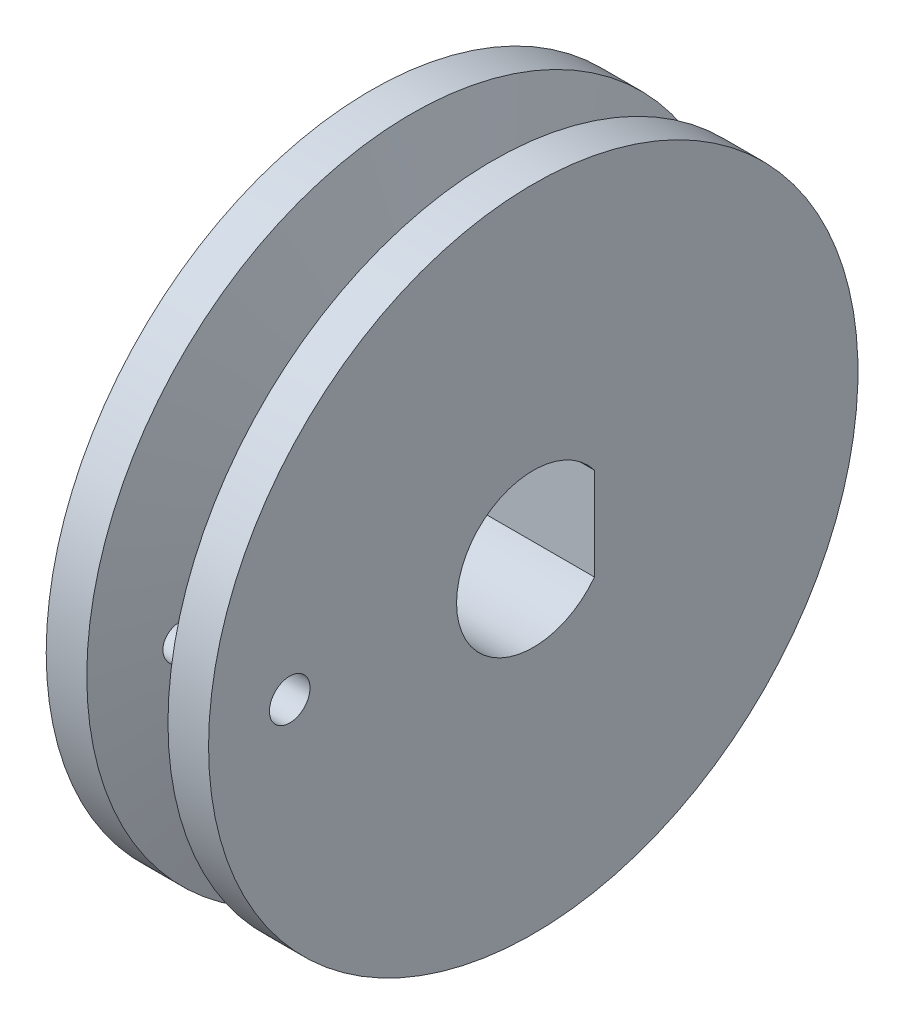
ISO-10303-21;
HEADER;
FILE_DESCRIPTION(('STEP AP214'),'2;1');
FILE_NAME('part.step','',(''),(''),'','','');
FILE_SCHEMA(('AUTOMOTIVE_DESIGN { 1 0 10303 214 1 1 1 1 }'));
ENDSEC;
DATA;
#1=APPLICATION_CONTEXT('core data for automotive mechanical design processes');
#2=APPLICATION_PROTOCOL_DEFINITION('international standard','automotive_design',2000,#1);
#3=PRODUCT_CONTEXT('',#1,'mechanical');
#4=PRODUCT('Part','Part','',(#3));
#5=PRODUCT_RELATED_PRODUCT_CATEGORY('part','',(#4));
#6=PRODUCT_DEFINITION_FORMATION('','',#4);
#7=PRODUCT_DEFINITION_CONTEXT('part definition',#1,'design');
#8=PRODUCT_DEFINITION('design','',#6,#7);
#9=PRODUCT_DEFINITION_SHAPE('','',#8);
#10=(LENGTH_UNIT() NAMED_UNIT(*) SI_UNIT(.MILLI.,.METRE.));
#11=(NAMED_UNIT(*) PLANE_ANGLE_UNIT() SI_UNIT($,.RADIAN.));
#12=(NAMED_UNIT(*) SI_UNIT($,.STERADIAN.) SOLID_ANGLE_UNIT());
#13=UNCERTAINTY_MEASURE_WITH_UNIT(LENGTH_MEASURE(1.E-05),#10,'distance_accuracy_value','');
#14=(GEOMETRIC_REPRESENTATION_CONTEXT(3) GLOBAL_UNCERTAINTY_ASSIGNED_CONTEXT((#13)) GLOBAL_UNIT_ASSIGNED_CONTEXT((#10,
#11,#12)) REPRESENTATION_CONTEXT('',''));
#15=CARTESIAN_POINT('',(0.,0.,0.));
#16=DIRECTION('',(0.,0.,1.));
#17=DIRECTION('',(1.,0.,0.));
#18=AXIS2_PLACEMENT_3D('',#15,#16,#17);
#19=CARTESIAN_POINT('',(0.,0.,0.));
#20=DIRECTION('',(1.,0.,0.));
#21=DIRECTION('',(0.,0.,-1.));
#22=AXIS2_PLACEMENT_3D('',#19,#20,#21);
#23=PLANE('',#22);
#24=CARTESIAN_POINT('',(0.,0.,9.525));
#25=DIRECTION('',(1.,0.,0.));
#26=DIRECTION('',(0.,0.,-1.));
#27=AXIS2_PLACEMENT_3D('',#24,#25,#26);
#28=CIRCLE('',#27,0.793749999999999);
#29=CARTESIAN_POINT('',(0.,0.,8.73125));
#30=VERTEX_POINT('',#29);
#31=EDGE_CURVE('E133',#30,#30,#28,.T.);
#32=ORIENTED_EDGE('',*,*,#31,.T.);
#33=EDGE_LOOP('',(#32));
#34=FACE_BOUND('',#33,.T.);
#35=DIRECTION('',(0.,1.,0.));
#36=VECTOR('',#35,1.);
#37=CARTESIAN_POINT('',(0.,-1.80937306039412,-2.392934));
#38=LINE('',#37,#36);
#39=CARTESIAN_POINT('',(0.,-1.80937306039412,-2.392934));
#40=VERTEX_POINT('',#39);
#41=CARTESIAN_POINT('',(0.,1.80937306039412,-2.392934));
#42=VERTEX_POINT('',#41);
#43=EDGE_CURVE('E134',#40,#42,#38,.T.);
#44=ORIENTED_EDGE('',*,*,#43,.T.);
#45=CARTESIAN_POINT('',(0.,0.,0.));
#46=DIRECTION('',(1.,0.,0.));
#47=DIRECTION('',(0.,0.,-1.));
#48=AXIS2_PLACEMENT_3D('',#45,#46,#47);
#49=CIRCLE('',#48,2.999994);
#50=EDGE_CURVE('E56',#42,#40,#49,.T.);
#51=ORIENTED_EDGE('',*,*,#50,.T.);
#52=EDGE_LOOP('',(#44,#51));
#53=FACE_BOUND('',#52,.T.);
#54=CARTESIAN_POINT('',(0.,0.,0.));
#55=DIRECTION('',(-1.,0.,0.));
#56=DIRECTION('',(0.,0.,1.));
#57=AXIS2_PLACEMENT_3D('',#54,#55,#56);
#58=CIRCLE('',#57,12.7);
#59=CARTESIAN_POINT('',(0.,0.,12.7));
#60=VERTEX_POINT('',#59);
#61=EDGE_CURVE('E71',#60,#60,#58,.T.);
#62=ORIENTED_EDGE('',*,*,#61,.T.);
#63=EDGE_LOOP('',(#62));
#64=FACE_BOUND('',#63,.T.);
#65=ADVANCED_FACE('F39',(#34,#53,#64),#23,.F.);
#66=CARTESIAN_POINT('',(0.,0.,0.));
#67=DIRECTION('',(-1.,0.,0.));
#68=DIRECTION('',(0.,0.,1.));
#69=AXIS2_PLACEMENT_3D('',#66,#67,#68);
#70=CYLINDRICAL_SURFACE('',#69,12.7);
#71=ORIENTED_EDGE('',*,*,#61,.F.);
#72=EDGE_LOOP('',(#71));
#73=FACE_BOUND('',#72,.T.);
#74=CARTESIAN_POINT('',(1.5875,0.,0.));
#75=DIRECTION('',(-1.,0.,0.));
#76=DIRECTION('',(0.,0.,1.));
#77=AXIS2_PLACEMENT_3D('',#74,#75,#76);
#78=CIRCLE('',#77,12.7);
#79=CARTESIAN_POINT('',(1.5875,0.,12.7));
#80=VERTEX_POINT('',#79);
#81=EDGE_CURVE('E94',#80,#80,#78,.T.);
#82=ORIENTED_EDGE('',*,*,#81,.T.);
#83=EDGE_LOOP('',(#82));
#84=FACE_BOUND('',#83,.T.);
#85=ADVANCED_FACE('F101',(#73,#84),#70,.T.);
#86=CARTESIAN_POINT('',(3.175,0.,0.));
#87=DIRECTION('',(-1.,0.,0.));
#88=DIRECTION('',(0.,0.,1.));
#89=AXIS2_PLACEMENT_3D('',#86,#87,#88);
#90=CONICAL_SURFACE('',#89,6.35,1.32581766366803);
#91=CARTESIAN_POINT('',(2.42205219299432,-0.769454038169109,9.33011658357974));
#92=CARTESIAN_POINT('',(2.4107397683525,-0.780716390235326,9.37459143730435));
#93=CARTESIAN_POINT('',(2.39926194634905,-0.788114447956199,9.42004158488257));
#94=CARTESIAN_POINT('',(2.37631328129466,-0.794965976843851,9.51158346613593));
#95=CARTESIAN_POINT('',(2.36484246799103,-0.794408834234208,9.5576759749713));
#96=CARTESIAN_POINT('',(2.34223718573583,-0.785325969239502,9.64914940975929));
#97=CARTESIAN_POINT('',(2.33110264204524,-0.776802031205737,9.69453049273836));
#98=CARTESIAN_POINT('',(2.30947412371127,-0.751972703506001,9.78325924612239));
#99=CARTESIAN_POINT('',(2.29897994845597,-0.73566976507489,9.8266075523516));
#100=CARTESIAN_POINT('',(2.278990224139,-0.695827860765712,9.90966566277669));
#101=CARTESIAN_POINT('',(2.26948762042817,-0.672345466460873,9.9494008686891));
#102=CARTESIAN_POINT('',(2.25164832094701,-0.618698986628892,10.0243742501778));
#103=CARTESIAN_POINT('',(2.2433115482243,-0.588535342447313,10.059612722554));
#104=CARTESIAN_POINT('',(2.22821570150382,-0.523124836186884,10.1236873497359));
#105=CARTESIAN_POINT('',(2.22142434817622,-0.488013033729028,10.152653727652));
#106=CARTESIAN_POINT('',(2.20936385433403,-0.413177442968312,10.2042555939953));
#107=CARTESIAN_POINT('',(2.20409446660112,-0.37345440515614,10.2268921105854));
#108=CARTESIAN_POINT('',(2.19534579931353,-0.291667519143426,10.2645552646822));
#109=CARTESIAN_POINT('',(2.19182249141825,-0.249694456047824,10.2797689017152));
#110=CARTESIAN_POINT('',(2.18645683687822,-0.163693260894292,10.3029629227268));
#111=CARTESIAN_POINT('',(2.18461427475093,-0.119665393036704,10.3109442339356));
#112=CARTESIAN_POINT('',(2.18268047804403,-0.0317205153053351,10.3193213412859));
#113=CARTESIAN_POINT('',(2.18255599141434,0.0121821036243596,10.3198611616056));
#114=CARTESIAN_POINT('',(2.18397594644027,0.0994485997530278,10.31370911978));
#115=CARTESIAN_POINT('',(2.18552030337281,0.142812504188165,10.3070176247507));
#116=CARTESIAN_POINT('',(2.1902235081368,0.227542214206593,10.2866771902879));
#117=CARTESIAN_POINT('',(2.19337390283262,0.268917252543197,10.2730646795583));
#118=CARTESIAN_POINT('',(2.20120102804999,0.348768662008727,10.2393375773391));
#119=CARTESIAN_POINT('',(2.20587780570822,0.387244943575136,10.2192227850508));
#120=CARTESIAN_POINT('',(2.21669286916985,0.460653344528927,10.1728744332704));
#121=CARTESIAN_POINT('',(2.22284580233666,0.495544590994493,10.1465796084351));
#122=CARTESIAN_POINT('',(2.23642925929041,0.560421009524583,10.0887865377969));
#123=CARTESIAN_POINT('',(2.24385990797108,0.590405701425073,10.0572877833339));
#124=CARTESIAN_POINT('',(2.25999223745678,0.64533947633634,9.98925173835838));
#125=CARTESIAN_POINT('',(2.26871846990885,0.670162012451892,9.95261812835679));
#126=CARTESIAN_POINT('',(2.28709444948894,0.713321956494704,9.87592432897158));
#127=CARTESIAN_POINT('',(2.2967443190179,0.731658503378802,9.83586368551041));
#128=CARTESIAN_POINT('',(2.31699423220166,0.761829185795334,9.75232967525658));
#129=CARTESIAN_POINT('',(2.32761263020919,0.773478956998256,9.70879414698943));
#130=CARTESIAN_POINT('',(2.34929907835624,0.78926123972469,9.62048945029555));
#131=CARTESIAN_POINT('',(2.36036718523181,0.793392799708368,9.5757201264417));
#132=CARTESIAN_POINT('',(2.38289693895834,0.794069681947352,9.48523291126329));
#133=CARTESIAN_POINT('',(2.39436198638339,0.790455826371187,9.43951461133943));
#134=CARTESIAN_POINT('',(2.41714022480215,0.7754173688962,9.3493390955973));
#135=CARTESIAN_POINT('',(2.4284534053784,0.763992233938164,9.30488196605978));
#136=CARTESIAN_POINT('',(2.45065613623344,0.733525871154754,9.21824438845325));
#137=CARTESIAN_POINT('',(2.46154295814856,0.714442334458217,9.17607809029142));
#138=CARTESIAN_POINT('',(2.48247518337972,0.669132132928347,9.09554029171331));
#139=CARTESIAN_POINT('',(2.49252062559318,0.642905798548822,9.05716861585485));
#140=CARTESIAN_POINT('',(2.51127883162215,0.58441857646217,8.98593933935526));
#141=CARTESIAN_POINT('',(2.52000895491806,0.552251669478756,8.95300922794292));
#142=CARTESIAN_POINT('',(2.53598108653367,0.482495172100332,8.89305754125928));
#143=CARTESIAN_POINT('',(2.54322335780507,0.444906541901772,8.86603492188837));
#144=CARTESIAN_POINT('',(2.55572698733986,0.366601024087381,8.81955542195992));
#145=CARTESIAN_POINT('',(2.56104228571078,0.326015430546006,8.79989192691016));
#146=CARTESIAN_POINT('',(2.56977107566086,0.241922381626515,8.76767666085327));
#147=CARTESIAN_POINT('',(2.57318496534634,0.19841554002219,8.75512340113552));
#148=CARTESIAN_POINT('',(2.57788327304305,0.111211864522665,8.7378637011833));
#149=CARTESIAN_POINT('',(2.57923220593459,0.0675654555564249,8.73291950522093));
#150=CARTESIAN_POINT('',(2.57994807930716,-0.0199593084126621,8.73029446481768));
#151=CARTESIAN_POINT('',(2.57931524288594,-0.0638376367520175,8.73261280279679));
#152=CARTESIAN_POINT('',(2.5761207720381,-0.149864711462099,8.74433665671649));
#153=CARTESIAN_POINT('',(2.57358924105494,-0.192029734982707,8.75363156220187));
#154=CARTESIAN_POINT('',(2.56673755248025,-0.274164685696527,8.77886423282008));
#155=CARTESIAN_POINT('',(2.5624174309054,-0.314134657072926,8.79480186418906));
#156=CARTESIAN_POINT('',(2.55211160965563,-0.391163870134534,8.83297790230852));
#157=CARTESIAN_POINT('',(2.54611114260483,-0.428193386772811,8.85527220649767));
#158=CARTESIAN_POINT('',(2.53268345462639,-0.497998569895608,8.90541607407123));
#159=CARTESIAN_POINT('',(2.52525570533439,-0.530772653512601,8.9332676948608));
#160=CARTESIAN_POINT('',(2.50900072337024,-0.592134142645329,8.99457451434313));
#161=CARTESIAN_POINT('',(2.50013952688928,-0.62057491303568,9.02816725222671));
#162=CARTESIAN_POINT('',(2.48147899929388,-0.671411652345604,9.09937571932279));
#163=CARTESIAN_POINT('',(2.47168061674636,-0.693813647467695,9.13698738522841));
#164=CARTESIAN_POINT('',(2.4551865253342,-0.725016062478383,9.20073799668404));
#165=CARTESIAN_POINT('',(2.44868136173061,-0.735784279409087,9.22598410778439));
#166=CARTESIAN_POINT('',(2.43548781139099,-0.754644605826032,9.277410012206));
#167=CARTESIAN_POINT('',(2.42879942188112,-0.762736674774386,9.3035898196641));
#168=CARTESIAN_POINT('',(2.42205219299432,-0.769454038169109,9.33011658357974));
#169=B_SPLINE_CURVE_WITH_KNOTS('',3,(#91,#92,#93,#94,#95,#96,#97,#98,#99,#100,#101,#102,#103,
#104,#105,#106,#107,#108,#109,#110,#111,#112,#113,#114,#115,#116,#117,#118,#119,#120,#121,#122,
#123,#124,#125,#126,#127,#128,#129,#130,#131,#132,#133,#134,#135,#136,#137,#138,#139,#140,#141,
#142,#143,#144,#145,#146,#147,#148,#149,#150,#151,#152,#153,#154,#155,#156,#157,#158,#159,#160,
#161,#162,#163,#164,#165,#166,#167,#168),.UNSPECIFIED.,.T.,.F.,(4,2,2,2,2,2,2,2,2,2,2,2,2,2,2,2,
2,2,2,2,2,2,2,2,2,2,2,2,2,2,2,2,2,2,2,2,2,2,4),(0.,0.141655720508065,0.283500454794621,
0.425313427226424,0.567081742562159,0.707760570981463,0.848430109302139,0.985816734799892,
1.12318103152947,1.25687870793566,1.39055924102077,1.52164877801541,1.65273166022999,
1.78313162330945,1.91353561368899,2.04529136306283,2.17705999858412,2.31175345744856,
2.446464790748,2.58473107559874,2.72301485885775,2.86416775439386,3.00533028348153,
3.14728364402572,3.2892304383665,3.4290988440258,3.56894250909702,3.7044973564221,
3.84002381135231,3.97122280764841,4.1024070347437,4.23155420089247,4.36069876654431,
4.49101597341395,4.62138151555874,4.75547740994333,4.88943898803018,4.97392742640404,
5.05841714453746),.UNSPECIFIED.);
#170=CARTESIAN_POINT('',(2.42205219299432,-0.769454038169109,9.33011658357974));
#171=VERTEX_POINT('',#170);
#172=EDGE_CURVE('E136',#171,#171,#169,.T.);
#173=ORIENTED_EDGE('',*,*,#172,.T.);
#174=EDGE_LOOP('',(#173));
#175=FACE_BOUND('',#174,.T.);
#176=ORIENTED_EDGE('',*,*,#81,.F.);
#177=EDGE_LOOP('',(#176));
#178=FACE_BOUND('',#177,.T.);
#179=CARTESIAN_POINT('',(3.175,0.,0.));
#180=DIRECTION('',(-1.,0.,0.));
#181=DIRECTION('',(0.,0.,1.));
#182=AXIS2_PLACEMENT_3D('',#179,#180,#181);
#183=CIRCLE('',#182,6.35);
#184=CARTESIAN_POINT('',(3.175,0.,6.35));
#185=VERTEX_POINT('',#184);
#186=EDGE_CURVE('E88',#185,#185,#183,.T.);
#187=ORIENTED_EDGE('',*,*,#186,.T.);
#188=EDGE_LOOP('',(#187));
#189=FACE_BOUND('',#188,.T.);
#190=ADVANCED_FACE('F104',(#175,#178,#189),#90,.T.);
#191=CARTESIAN_POINT('',(4.7625,0.,0.));
#192=DIRECTION('',(1.,0.,0.));
#193=DIRECTION('',(0.,0.,-1.));
#194=AXIS2_PLACEMENT_3D('',#191,#192,#193);
#195=CONICAL_SURFACE('',#194,12.7,1.32581766366803);
#196=CARTESIAN_POINT('',(3.83070579651291,-0.553172418404177,8.95575546121326));
#197=CARTESIAN_POINT('',(3.8226501169073,-0.521933557501701,8.92540077208031));
#198=CARTESIAN_POINT('',(3.81520880843085,-0.488090785213117,8.89752539532311));
#199=CARTESIAN_POINT('',(3.80182802899131,-0.416048130562721,8.84760331828426));
#200=CARTESIAN_POINT('',(3.79588978982982,-0.377844711505156,8.82556139799123));
#201=CARTESIAN_POINT('',(3.78574856534504,-0.298083398337058,8.78802729593576));
#202=CARTESIAN_POINT('',(3.78154703820206,-0.256522720254359,8.77254061783296));
#203=CARTESIAN_POINT('',(3.77506493995993,-0.171270543452017,8.7486856337757));
#204=CARTESIAN_POINT('',(3.77278386449617,-0.127579607388895,8.74031545882169));
#205=CARTESIAN_POINT('',(3.77026614279917,-0.0402316721559613,8.73107870423358));
#206=CARTESIAN_POINT('',(3.7699898833395,0.00340884622874602,8.73006673281927));
#207=CARTESIAN_POINT('',(3.77138894885985,0.0902339836528058,8.73519755721904));
#208=CARTESIAN_POINT('',(3.77306418966141,0.133418622275572,8.7413400444237));
#209=CARTESIAN_POINT('',(3.77827094839557,0.217709537471058,8.7604786315969));
#210=CARTESIAN_POINT('',(3.78178562253552,0.258831022452696,8.77341254558769));
#211=CARTESIAN_POINT('',(3.7905192338726,0.338289873446917,8.80566839283249));
#212=CARTESIAN_POINT('',(3.79573825888268,0.376627095882037,8.82499065523279));
#213=CARTESIAN_POINT('',(3.80777483532391,0.450086617382977,8.86975987766068));
#214=CARTESIAN_POINT('',(3.81461573768382,0.485150402094539,8.89529646543999));
#215=CARTESIAN_POINT('',(3.82960366768637,0.550510457849968,8.95155648062381));
#216=CARTESIAN_POINT('',(3.83775087982657,0.580806054256001,8.98228064073124));
#217=CARTESIAN_POINT('',(3.85535020759874,0.63677124780232,9.04906166215024));
#218=CARTESIAN_POINT('',(3.86483486968982,0.662268942745431,9.08525398525138));
#219=CARTESIAN_POINT('',(3.88460167081465,0.706843335139842,9.16119899010507));
#220=CARTESIAN_POINT('',(3.89488394005287,0.725918981505469,9.20095225332389));
#221=CARTESIAN_POINT('',(3.91626860599696,0.757699269309973,9.28421596338031));
#222=CARTESIAN_POINT('',(3.92738652120266,0.77018907078793,9.32780450939148));
#223=CARTESIAN_POINT('',(3.94982465741442,0.787584363303121,9.41642077261426));
#224=CARTESIAN_POINT('',(3.96114490152719,0.792488982413464,9.46144865467234));
#225=CARTESIAN_POINT('',(3.98386990657641,0.794601532354579,9.55248844436271));
#226=CARTESIAN_POINT('',(3.99527279128981,0.791676122199685,9.598503991423));
#227=CARTESIAN_POINT('',(4.0176524620036,0.777890309896697,9.68944025674841));
#228=CARTESIAN_POINT('',(4.02862924081322,0.767029773900296,9.73436095653265));
#229=CARTESIAN_POINT('',(4.04983111566855,0.737656210308763,9.82167891820033));
#230=CARTESIAN_POINT('',(4.06005813394219,0.719163619846879,9.86408257596859));
#231=CARTESIAN_POINT('',(4.07951471602818,0.67497757880394,9.94521089057452));
#232=CARTESIAN_POINT('',(4.08874436988053,0.649284778996665,9.98393587947656));
#233=CARTESIAN_POINT('',(4.10578323663681,0.591938736870011,10.0557717760989));
#234=CARTESIAN_POINT('',(4.11361660548262,0.560411275763662,10.0889773052082));
#235=CARTESIAN_POINT('',(4.1278635877556,0.491935827080444,10.1496024461819));
#236=CARTESIAN_POINT('',(4.13427741814604,0.454988669291257,10.1770229422049));
#237=CARTESIAN_POINT('',(4.14535313397579,0.377788212812774,10.2245096735313));
#238=CARTESIAN_POINT('',(4.15005740372566,0.337650201543156,10.2447534708958));
#239=CARTESIAN_POINT('',(4.15781924514125,0.254396678761466,10.2782152123266));
#240=CARTESIAN_POINT('',(4.16087705488699,0.211281598754792,10.2914341721889));
#241=CARTESIAN_POINT('',(4.16520930890854,0.124365951976384,10.3101772547028));
#242=CARTESIAN_POINT('',(4.1665231320406,0.0806039252199313,10.3158712753219));
#243=CARTESIAN_POINT('',(4.16746082176568,-0.00727542580714762,10.3199342553908));
#244=CARTESIAN_POINT('',(4.16708482420145,-0.0513927212335289,10.3183038036464));
#245=CARTESIAN_POINT('',(4.16466651128666,-0.138236108697696,10.3078298737771));
#246=CARTESIAN_POINT('',(4.16264196021815,-0.180972006501115,10.2990632926136));
#247=CARTESIAN_POINT('',(4.15700360463252,-0.264337851367075,10.2747002653199));
#248=CARTESIAN_POINT('',(4.15338979679768,-0.304967794033038,10.2591038049318));
#249=CARTESIAN_POINT('',(4.14464574437318,-0.383208731762279,10.2214797712761));
#250=CARTESIAN_POINT('',(4.13950789124598,-0.420803346005979,10.1994199376578));
#251=CARTESIAN_POINT('',(4.12785563972507,-0.491746973918788,10.1495828197219));
#252=CARTESIAN_POINT('',(4.12134113285138,-0.525095652677228,10.1218050848396));
#253=CARTESIAN_POINT('',(4.1069650722164,-0.587284465695502,10.0607881216998));
#254=CARTESIAN_POINT('',(4.09908056096409,-0.616028389592663,10.0274562936538));
#255=CARTESIAN_POINT('',(4.08225089021149,-0.667531042920907,9.95669114298756));
#256=CARTESIAN_POINT('',(4.07330559622484,-0.690289012271286,9.91925730035842));
#257=CARTESIAN_POINT('',(4.05432993286275,-0.729801328971478,9.84032070117941));
#258=CARTESIAN_POINT('',(4.04427740825337,-0.746384310273909,9.79873749138116));
#259=CARTESIAN_POINT('',(4.02354198486029,-0.772321868904998,9.71352627688356));
#260=CARTESIAN_POINT('',(4.01285902521286,-0.781675747085559,9.66989807483959));
#261=CARTESIAN_POINT('',(3.99087379794185,-0.793095950870256,9.58072957887246));
#262=CARTESIAN_POINT('',(3.97956284245699,-0.794983563117689,9.53516848930875));
#263=CARTESIAN_POINT('',(3.95686493457629,-0.790953153067578,9.44439726829093));
#264=CARTESIAN_POINT('',(3.94547795830256,-0.785032551211552,9.39918725778513));
#265=CARTESIAN_POINT('',(3.9228121785646,-0.765416894369596,9.30983899875305));
#266=CARTESIAN_POINT('',(3.91153642624175,-0.751627150992616,9.26572076079837));
#267=CARTESIAN_POINT('',(3.88959017602667,-0.716550752446095,9.18044987443879));
#268=CARTESIAN_POINT('',(3.87891900032223,-0.695272693845058,9.1392938903569));
#269=CARTESIAN_POINT('',(3.86189309025316,-0.653946750020879,9.07405018916609));
#270=CARTESIAN_POINT('',(3.85527445178118,-0.635802702694446,9.04880602027882));
#271=CARTESIAN_POINT('',(3.84256730887345,-0.596608959464142,9.00053532414233));
#272=CARTESIAN_POINT('',(3.8364787919781,-0.575559331881031,8.97750874477112));
#273=CARTESIAN_POINT('',(3.83070579651291,-0.553172418404177,8.95575546121326));
#274=B_SPLINE_CURVE_WITH_KNOTS('',3,(#196,#197,#198,#199,#200,#201,#202,#203,#204,#205,#206,
#207,#208,#209,#210,#211,#212,#213,#214,#215,#216,#217,#218,#219,#220,#221,#222,#223,#224,#225,
#226,#227,#228,#229,#230,#231,#232,#233,#234,#235,#236,#237,#238,#239,#240,#241,#242,#243,#244,
#245,#246,#247,#248,#249,#250,#251,#252,#253,#254,#255,#256,#257,#258,#259,#260,#261,#262,#263,
#264,#265,#266,#267,#268,#269,#270,#271,#272,#273),.UNSPECIFIED.,.T.,.F.,(4,2,2,2,2,2,2,2,2,2,2,
2,2,2,2,2,2,2,2,2,2,2,2,2,2,2,2,2,2,2,2,2,2,2,2,2,2,2,4),(0.,0.132778228382514,
0.265664921962796,0.398662964503716,0.531626067112961,0.661954608624954,0.792277528590002,
0.921427431466439,1.05058398955881,1.18172698661214,1.3128885220789,1.448103600548,
1.58334079869047,1.72275256795111,1.86218036159087,2.00399757304642,2.14581717670495,
2.28725945448917,2.42868895247061,2.56736498579549,2.70601980911612,2.84095485679249,
2.97587038746145,3.1076845830045,3.23948818234512,3.36989001373498,3.50029211735223,
3.6313565136805,3.76243124170284,3.89596250579713,4.0295107171624,4.1665290912435,
4.30356071512198,4.44385318119121,4.5841920065541,4.72625623319812,4.86815789960203,
4.96331388507765,5.05846763347101),.UNSPECIFIED.);
#275=CARTESIAN_POINT('',(3.83070579651291,-0.553172418404177,8.95575546121326));
#276=VERTEX_POINT('',#275);
#277=EDGE_CURVE('E145',#276,#276,#274,.T.);
#278=ORIENTED_EDGE('',*,*,#277,.T.);
#279=EDGE_LOOP('',(#278));
#280=FACE_BOUND('',#279,.T.);
#281=ORIENTED_EDGE('',*,*,#186,.F.);
#282=EDGE_LOOP('',(#281));
#283=FACE_BOUND('',#282,.T.);
#284=CARTESIAN_POINT('',(4.7625,0.,0.));
#285=DIRECTION('',(-1.,0.,0.));
#286=DIRECTION('',(0.,0.,1.));
#287=AXIS2_PLACEMENT_3D('',#284,#285,#286);
#288=CIRCLE('',#287,12.7);
#289=CARTESIAN_POINT('',(4.7625,0.,12.7));
#290=VERTEX_POINT('',#289);
#291=EDGE_CURVE('E85',#290,#290,#288,.T.);
#292=ORIENTED_EDGE('',*,*,#291,.T.);
#293=EDGE_LOOP('',(#292));
#294=FACE_BOUND('',#293,.T.);
#295=ADVANCED_FACE('F109',(#280,#283,#294),#195,.T.);
#296=CARTESIAN_POINT('',(0.,0.,0.));
#297=DIRECTION('',(-1.,0.,0.));
#298=DIRECTION('',(0.,0.,1.));
#299=AXIS2_PLACEMENT_3D('',#296,#297,#298);
#300=CYLINDRICAL_SURFACE('',#299,12.7);
#301=ORIENTED_EDGE('',*,*,#291,.F.);
#302=EDGE_LOOP('',(#301));
#303=FACE_BOUND('',#302,.T.);
#304=CARTESIAN_POINT('',(6.35,0.,0.));
#305=DIRECTION('',(-1.,0.,0.));
#306=DIRECTION('',(0.,0.,1.));
#307=AXIS2_PLACEMENT_3D('',#304,#305,#306);
#308=CIRCLE('',#307,12.7);
#309=CARTESIAN_POINT('',(6.35,0.,12.7));
#310=VERTEX_POINT('',#309);
#311=EDGE_CURVE('E74',#310,#310,#308,.T.);
#312=ORIENTED_EDGE('',*,*,#311,.T.);
#313=EDGE_LOOP('',(#312));
#314=FACE_BOUND('',#313,.T.);
#315=ADVANCED_FACE('F79',(#303,#314),#300,.T.);
#316=CARTESIAN_POINT('',(6.35,12.7,0.));
#317=DIRECTION('',(-1.,0.,0.));
#318=DIRECTION('',(0.,0.,1.));
#319=AXIS2_PLACEMENT_3D('',#316,#317,#318);
#320=PLANE('',#319);
#321=CARTESIAN_POINT('',(6.35,0.,9.525));
#322=DIRECTION('',(-1.,0.,0.));
#323=DIRECTION('',(0.,0.,1.));
#324=AXIS2_PLACEMENT_3D('',#321,#322,#323);
#325=CIRCLE('',#324,0.793749999999999);
#326=CARTESIAN_POINT('',(6.35,0.,10.31875));
#327=VERTEX_POINT('',#326);
#328=EDGE_CURVE('E42',#327,#327,#325,.T.);
#329=ORIENTED_EDGE('',*,*,#328,.T.);
#330=EDGE_LOOP('',(#329));
#331=FACE_BOUND('',#330,.T.);
#332=DIRECTION('',(0.,1.,0.));
#333=VECTOR('',#332,1.);
#334=CARTESIAN_POINT('',(6.35,12.7,-2.392934));
#335=LINE('',#334,#333);
#336=CARTESIAN_POINT('',(6.35,1.80937306039412,-2.392934));
#337=VERTEX_POINT('',#336);
#338=CARTESIAN_POINT('',(6.35,-1.80937306039412,-2.392934));
#339=VERTEX_POINT('',#338);
#340=EDGE_CURVE('E48',#337,#339,#335,.F.);
#341=ORIENTED_EDGE('',*,*,#340,.T.);
#342=CARTESIAN_POINT('',(6.35,0.,0.));
#343=DIRECTION('',(1.,0.,0.));
#344=DIRECTION('',(0.,0.,-1.));
#345=AXIS2_PLACEMENT_3D('',#342,#343,#344);
#346=CIRCLE('',#345,2.999994);
#347=EDGE_CURVE('E11',#339,#337,#346,.F.);
#348=ORIENTED_EDGE('',*,*,#347,.T.);
#349=EDGE_LOOP('',(#341,#348));
#350=FACE_BOUND('',#349,.T.);
#351=ORIENTED_EDGE('',*,*,#311,.F.);
#352=EDGE_LOOP('',(#351));
#353=FACE_BOUND('',#352,.T.);
#354=ADVANCED_FACE('F76',(#331,#350,#353),#320,.F.);
#355=CARTESIAN_POINT('',(0.,0.,0.));
#356=DIRECTION('',(1.,0.,0.));
#357=DIRECTION('',(0.,0.,-1.));
#358=AXIS2_PLACEMENT_3D('',#355,#356,#357);
#359=CYLINDRICAL_SURFACE('',#358,2.999994);
#360=DIRECTION('',(1.,0.,0.));
#361=VECTOR('',#360,1.);
#362=CARTESIAN_POINT('',(0.,-1.80937306039412,-2.392934));
#363=LINE('',#362,#361);
#364=EDGE_CURVE('E62',#40,#339,#363,.T.);
#365=ORIENTED_EDGE('',*,*,#364,.F.);
#366=ORIENTED_EDGE('',*,*,#50,.F.);
#367=DIRECTION('',(1.,0.,0.));
#368=VECTOR('',#367,1.);
#369=CARTESIAN_POINT('',(0.,1.80937306039412,-2.392934));
#370=LINE('',#369,#368);
#371=EDGE_CURVE('E68',#42,#337,#370,.T.);
#372=ORIENTED_EDGE('',*,*,#371,.T.);
#373=ORIENTED_EDGE('',*,*,#347,.F.);
#374=EDGE_LOOP('',(#365,#366,#372,#373));
#375=FACE_BOUND('',#374,.T.);
#376=ADVANCED_FACE('F73',(#375),#359,.F.);
#377=CARTESIAN_POINT('',(0.,-1.80937306039412,-2.392934));
#378=DIRECTION('',(0.,0.,-1.));
#379=DIRECTION('',(-1.,0.,0.));
#380=AXIS2_PLACEMENT_3D('',#377,#378,#379);
#381=PLANE('',#380);
#382=ORIENTED_EDGE('',*,*,#371,.F.);
#383=ORIENTED_EDGE('',*,*,#43,.F.);
#384=ORIENTED_EDGE('',*,*,#364,.T.);
#385=ORIENTED_EDGE('',*,*,#340,.F.);
#386=EDGE_LOOP('',(#382,#383,#384,#385));
#387=FACE_BOUND('',#386,.T.);
#388=ADVANCED_FACE('F67',(#387),#381,.F.);
#389=CARTESIAN_POINT('',(0.,0.,9.525));
#390=DIRECTION('',(1.,0.,0.));
#391=DIRECTION('',(0.,0.,-1.));
#392=AXIS2_PLACEMENT_3D('',#389,#390,#391);
#393=CYLINDRICAL_SURFACE('',#392,0.793749999999999);
#394=ORIENTED_EDGE('',*,*,#328,.F.);
#395=EDGE_LOOP('',(#394));
#396=FACE_BOUND('',#395,.T.);
#397=ORIENTED_EDGE('',*,*,#277,.F.);
#398=EDGE_LOOP('',(#397));
#399=FACE_BOUND('',#398,.T.);
#400=ADVANCED_FACE('F155',(#396,#399),#393,.F.);
#401=ORIENTED_EDGE('',*,*,#31,.F.);
#402=EDGE_LOOP('',(#401));
#403=FACE_BOUND('',#402,.T.);
#404=ORIENTED_EDGE('',*,*,#172,.F.);
#405=EDGE_LOOP('',(#404));
#406=FACE_BOUND('',#405,.T.);
#407=ADVANCED_FACE('F151',(#403,#406),#393,.F.);
#408=CLOSED_SHELL('',(#65,#85,#190,#295,#315,#354,#376,#388,#400,#407));
#409=MANIFOLD_SOLID_BREP('B2',#408);
#410=ADVANCED_BREP_SHAPE_REPRESENTATION('',(#18,#409),#14);
#411=SHAPE_DEFINITION_REPRESENTATION(#9,#410);
ENDSEC;
END-ISO-10303-21;
